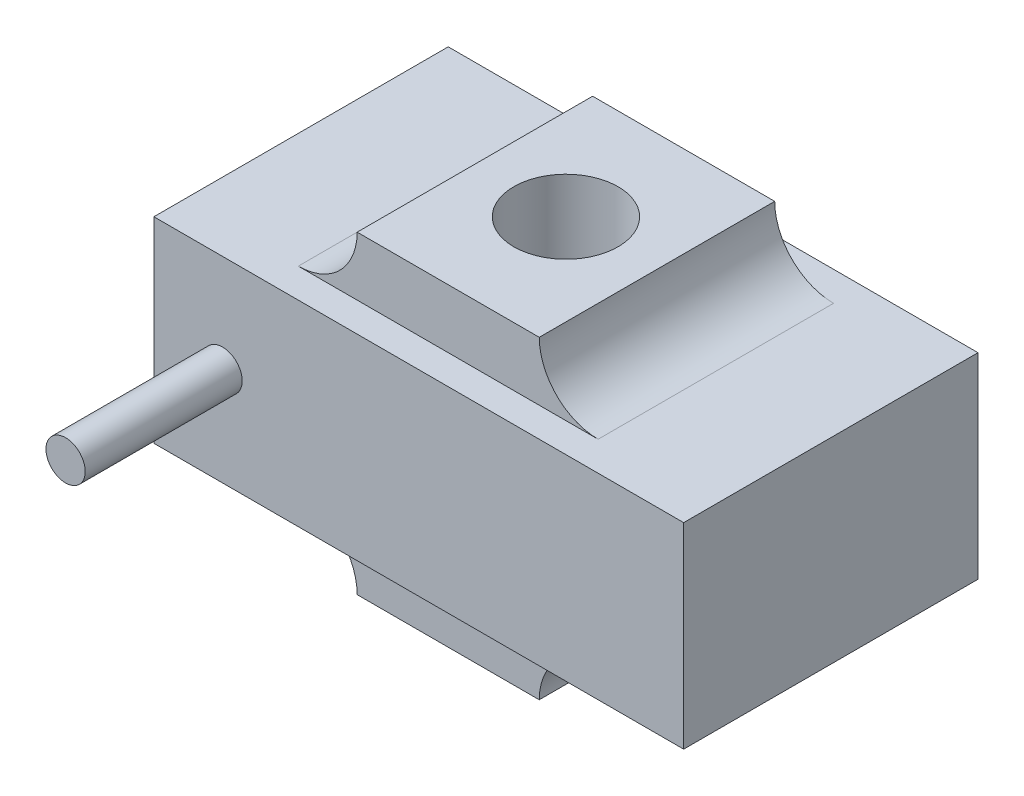
ISO-10303-21;
HEADER;
FILE_DESCRIPTION(('STEP AP214'),'2;1');
FILE_NAME('part.step','',(''),(''),'','','');
FILE_SCHEMA(('AUTOMOTIVE_DESIGN { 1 0 10303 214 1 1 1 1 }'));
ENDSEC;
DATA;
#1=APPLICATION_CONTEXT('core data for automotive mechanical design processes');
#2=APPLICATION_PROTOCOL_DEFINITION('international standard','automotive_design',2000,#1);
#3=PRODUCT_CONTEXT('',#1,'mechanical');
#4=PRODUCT('Part','Part','',(#3));
#5=PRODUCT_RELATED_PRODUCT_CATEGORY('part','',(#4));
#6=PRODUCT_DEFINITION_FORMATION('','',#4);
#7=PRODUCT_DEFINITION_CONTEXT('part definition',#1,'design');
#8=PRODUCT_DEFINITION('design','',#6,#7);
#9=PRODUCT_DEFINITION_SHAPE('','',#8);
#10=(LENGTH_UNIT() NAMED_UNIT(*) SI_UNIT(.MILLI.,.METRE.));
#11=(NAMED_UNIT(*) PLANE_ANGLE_UNIT() SI_UNIT($,.RADIAN.));
#12=(NAMED_UNIT(*) SI_UNIT($,.STERADIAN.) SOLID_ANGLE_UNIT());
#13=UNCERTAINTY_MEASURE_WITH_UNIT(LENGTH_MEASURE(1.E-05),#10,'distance_accuracy_value','');
#14=(GEOMETRIC_REPRESENTATION_CONTEXT(3) GLOBAL_UNCERTAINTY_ASSIGNED_CONTEXT((#13)) GLOBAL_UNIT_ASSIGNED_CONTEXT((#10,
#11,#12)) REPRESENTATION_CONTEXT('',''));
#15=CARTESIAN_POINT('',(0.,0.,0.));
#16=DIRECTION('',(0.,0.,1.));
#17=DIRECTION('',(1.,0.,0.));
#18=AXIS2_PLACEMENT_3D('',#15,#16,#17);
#19=CARTESIAN_POINT('',(-21.43125,-7.9375,11.90625));
#20=DIRECTION('',(0.,0.,1.));
#21=DIRECTION('',(1.,0.,0.));
#22=AXIS2_PLACEMENT_3D('',#19,#20,#21);
#23=PLANE('',#22);
#24=DIRECTION('',(0.,-1.,0.));
#25=VECTOR('',#24,1.);
#26=CARTESIAN_POINT('',(-21.43125,7.9375,11.90625));
#27=LINE('',#26,#25);
#28=CARTESIAN_POINT('',(-21.43125,7.9375,11.90625));
#29=VERTEX_POINT('',#28);
#30=CARTESIAN_POINT('',(-21.43125,-7.9375,11.90625));
#31=VERTEX_POINT('',#30);
#32=EDGE_CURVE('E213',#29,#31,#27,.T.);
#33=ORIENTED_EDGE('',*,*,#32,.T.);
#34=DIRECTION('',(1.,0.,0.));
#35=VECTOR('',#34,1.);
#36=CARTESIAN_POINT('',(-21.43125,-7.9375,11.90625));
#37=LINE('',#36,#35);
#38=CARTESIAN_POINT('',(21.43125,-7.9375,11.90625));
#39=VERTEX_POINT('',#38);
#40=EDGE_CURVE('E216',#31,#39,#37,.T.);
#41=ORIENTED_EDGE('',*,*,#40,.T.);
#42=DIRECTION('',(0.,1.,0.));
#43=VECTOR('',#42,1.);
#44=CARTESIAN_POINT('',(21.43125,7.9375,11.90625));
#45=LINE('',#44,#43);
#46=CARTESIAN_POINT('',(21.43125,7.9375,11.90625));
#47=VERTEX_POINT('',#46);
#48=EDGE_CURVE('E218',#39,#47,#45,.T.);
#49=ORIENTED_EDGE('',*,*,#48,.T.);
#50=DIRECTION('',(-1.,0.,0.));
#51=VECTOR('',#50,1.);
#52=CARTESIAN_POINT('',(-21.43125,7.9375,11.90625));
#53=LINE('',#52,#51);
#54=EDGE_CURVE('E220',#47,#29,#53,.T.);
#55=ORIENTED_EDGE('',*,*,#54,.T.);
#56=EDGE_LOOP('',(#33,#41,#49,#55));
#57=FACE_BOUND('',#56,.T.);
#58=CARTESIAN_POINT('',(-15.875,0.,11.90625));
#59=DIRECTION('',(0.,0.,1.));
#60=DIRECTION('',(1.,0.,0.));
#61=AXIS2_PLACEMENT_3D('',#58,#59,#60);
#62=CIRCLE('',#61,1.5875);
#63=CARTESIAN_POINT('',(-14.2875,0.,11.90625));
#64=VERTEX_POINT('',#63);
#65=EDGE_CURVE('E138',#64,#64,#62,.T.);
#66=ORIENTED_EDGE('',*,*,#65,.F.);
#67=EDGE_LOOP('',(#66));
#68=FACE_BOUND('',#67,.T.);
#69=ADVANCED_FACE('F30',(#57,#68),#23,.T.);
#70=CARTESIAN_POINT('',(-21.43125,7.9375,11.90625));
#71=DIRECTION('',(0.,-1.,0.));
#72=DIRECTION('',(0.,0.,-1.));
#73=AXIS2_PLACEMENT_3D('',#70,#71,#72);
#74=PLANE('',#73);
#75=DIRECTION('',(-1.,0.,0.));
#76=VECTOR('',#75,1.);
#77=CARTESIAN_POINT('',(-21.43125,7.9375,-11.90625));
#78=LINE('',#77,#76);
#79=CARTESIAN_POINT('',(21.43125,7.9375,-11.90625));
#80=VERTEX_POINT('',#79);
#81=CARTESIAN_POINT('',(-21.43125,7.9375,-11.90625));
#82=VERTEX_POINT('',#81);
#83=EDGE_CURVE('E211',#80,#82,#78,.T.);
#84=ORIENTED_EDGE('',*,*,#83,.T.);
#85=DIRECTION('',(0.,0.,-1.));
#86=VECTOR('',#85,1.);
#87=CARTESIAN_POINT('',(-21.43125,7.9375,11.90625));
#88=LINE('',#87,#86);
#89=EDGE_CURVE('E222',#29,#82,#88,.T.);
#90=ORIENTED_EDGE('',*,*,#89,.F.);
#91=ORIENTED_EDGE('',*,*,#54,.F.);
#92=DIRECTION('',(0.,0.,-1.));
#93=VECTOR('',#92,1.);
#94=CARTESIAN_POINT('',(21.43125,7.9375,11.90625));
#95=LINE('',#94,#93);
#96=EDGE_CURVE('E225',#47,#80,#95,.T.);
#97=ORIENTED_EDGE('',*,*,#96,.T.);
#98=EDGE_LOOP('',(#84,#90,#91,#97));
#99=FACE_BOUND('',#98,.T.);
#100=DIRECTION('',(1.,0.,0.));
#101=VECTOR('',#100,1.);
#102=CARTESIAN_POINT('',(12.1285,7.9375,9.525));
#103=LINE('',#102,#101);
#104=CARTESIAN_POINT('',(-12.1285,7.9375,9.525));
#105=VERTEX_POINT('',#104);
#106=CARTESIAN_POINT('',(12.1285,7.9375,9.525));
#107=VERTEX_POINT('',#106);
#108=EDGE_CURVE('E186',#105,#107,#103,.T.);
#109=ORIENTED_EDGE('',*,*,#108,.F.);
#110=DIRECTION('',(0.,0.,-1.));
#111=VECTOR('',#110,1.);
#112=CARTESIAN_POINT('',(-12.1285,7.9375,9.525));
#113=LINE('',#112,#111);
#114=CARTESIAN_POINT('',(-12.1285,7.9375,-9.525));
#115=VERTEX_POINT('',#114);
#116=EDGE_CURVE('E201',#105,#115,#113,.T.);
#117=ORIENTED_EDGE('',*,*,#116,.T.);
#118=DIRECTION('',(1.,0.,0.));
#119=VECTOR('',#118,1.);
#120=CARTESIAN_POINT('',(12.1285,7.9375,-9.525));
#121=LINE('',#120,#119);
#122=CARTESIAN_POINT('',(12.1285,7.9375,-9.525));
#123=VERTEX_POINT('',#122);
#124=EDGE_CURVE('E177',#115,#123,#121,.T.);
#125=ORIENTED_EDGE('',*,*,#124,.T.);
#126=DIRECTION('',(0.,0.,-1.));
#127=VECTOR('',#126,1.);
#128=CARTESIAN_POINT('',(12.1285,7.9375,9.525));
#129=LINE('',#128,#127);
#130=EDGE_CURVE('E198',#107,#123,#129,.T.);
#131=ORIENTED_EDGE('',*,*,#130,.F.);
#132=EDGE_LOOP('',(#109,#117,#125,#131));
#133=FACE_BOUND('',#132,.T.);
#134=ADVANCED_FACE('F241',(#99,#133),#74,.F.);
#135=CARTESIAN_POINT('',(-21.43125,7.9375,11.90625));
#136=DIRECTION('',(1.,0.,0.));
#137=DIRECTION('',(0.,0.,-1.));
#138=AXIS2_PLACEMENT_3D('',#135,#136,#137);
#139=PLANE('',#138);
#140=DIRECTION('',(0.,-1.,0.));
#141=VECTOR('',#140,1.);
#142=CARTESIAN_POINT('',(-21.43125,7.9375,-11.90625));
#143=LINE('',#142,#141);
#144=CARTESIAN_POINT('',(-21.43125,-7.9375,-11.90625));
#145=VERTEX_POINT('',#144);
#146=EDGE_CURVE('E204',#82,#145,#143,.T.);
#147=ORIENTED_EDGE('',*,*,#146,.T.);
#148=DIRECTION('',(0.,0.,-1.));
#149=VECTOR('',#148,1.);
#150=CARTESIAN_POINT('',(-21.43125,-7.9375,11.90625));
#151=LINE('',#150,#149);
#152=EDGE_CURVE('E11',#31,#145,#151,.T.);
#153=ORIENTED_EDGE('',*,*,#152,.F.);
#154=ORIENTED_EDGE('',*,*,#32,.F.);
#155=ORIENTED_EDGE('',*,*,#89,.T.);
#156=EDGE_LOOP('',(#147,#153,#154,#155));
#157=FACE_BOUND('',#156,.T.);
#158=ADVANCED_FACE('F32',(#157),#139,.F.);
#159=CARTESIAN_POINT('',(-21.43125,-7.9375,11.90625));
#160=DIRECTION('',(0.,1.,0.));
#161=DIRECTION('',(0.,0.,1.));
#162=AXIS2_PLACEMENT_3D('',#159,#160,#161);
#163=PLANE('',#162);
#164=DIRECTION('',(0.,0.,-1.));
#165=VECTOR('',#164,1.);
#166=CARTESIAN_POINT('',(-12.1285,-7.9375,9.525));
#167=LINE('',#166,#165);
#168=CARTESIAN_POINT('',(-12.1285,-7.9375,9.525));
#169=VERTEX_POINT('',#168);
#170=CARTESIAN_POINT('',(-12.1285,-7.9375,-9.525));
#171=VERTEX_POINT('',#170);
#172=EDGE_CURVE('E45',#169,#171,#167,.T.);
#173=ORIENTED_EDGE('',*,*,#172,.F.);
#174=DIRECTION('',(-1.,0.,0.));
#175=VECTOR('',#174,1.);
#176=CARTESIAN_POINT('',(-12.1285,-7.9375,9.525));
#177=LINE('',#176,#175);
#178=CARTESIAN_POINT('',(12.1285,-7.9375,9.525));
#179=VERTEX_POINT('',#178);
#180=EDGE_CURVE('E49',#179,#169,#177,.T.);
#181=ORIENTED_EDGE('',*,*,#180,.F.);
#182=DIRECTION('',(0.,0.,-1.));
#183=VECTOR('',#182,1.);
#184=CARTESIAN_POINT('',(12.1285,-7.9375,9.525));
#185=LINE('',#184,#183);
#186=CARTESIAN_POINT('',(12.1285,-7.9375,-9.525));
#187=VERTEX_POINT('',#186);
#188=EDGE_CURVE('E166',#179,#187,#185,.T.);
#189=ORIENTED_EDGE('',*,*,#188,.T.);
#190=DIRECTION('',(-1.,0.,0.));
#191=VECTOR('',#190,1.);
#192=CARTESIAN_POINT('',(-12.1285,-7.9375,-9.525));
#193=LINE('',#192,#191);
#194=EDGE_CURVE('E155',#187,#171,#193,.T.);
#195=ORIENTED_EDGE('',*,*,#194,.T.);
#196=EDGE_LOOP('',(#173,#181,#189,#195));
#197=FACE_BOUND('',#196,.T.);
#198=DIRECTION('',(1.,0.,0.));
#199=VECTOR('',#198,1.);
#200=CARTESIAN_POINT('',(-21.43125,-7.9375,-11.90625));
#201=LINE('',#200,#199);
#202=CARTESIAN_POINT('',(21.43125,-7.9375,-11.90625));
#203=VERTEX_POINT('',#202);
#204=EDGE_CURVE('E207',#145,#203,#201,.T.);
#205=ORIENTED_EDGE('',*,*,#204,.T.);
#206=DIRECTION('',(0.,0.,-1.));
#207=VECTOR('',#206,1.);
#208=CARTESIAN_POINT('',(21.43125,-7.9375,11.90625));
#209=LINE('',#208,#207);
#210=EDGE_CURVE('E38',#39,#203,#209,.T.);
#211=ORIENTED_EDGE('',*,*,#210,.F.);
#212=ORIENTED_EDGE('',*,*,#40,.F.);
#213=ORIENTED_EDGE('',*,*,#152,.T.);
#214=EDGE_LOOP('',(#205,#211,#212,#213));
#215=FACE_BOUND('',#214,.T.);
#216=ADVANCED_FACE('F249',(#197,#215),#163,.F.);
#217=CARTESIAN_POINT('',(21.43125,7.9375,11.90625));
#218=DIRECTION('',(-1.,0.,0.));
#219=DIRECTION('',(0.,0.,1.));
#220=AXIS2_PLACEMENT_3D('',#217,#218,#219);
#221=PLANE('',#220);
#222=DIRECTION('',(0.,1.,0.));
#223=VECTOR('',#222,1.);
#224=CARTESIAN_POINT('',(21.43125,7.9375,-11.90625));
#225=LINE('',#224,#223);
#226=EDGE_CURVE('E209',#203,#80,#225,.T.);
#227=ORIENTED_EDGE('',*,*,#226,.T.);
#228=ORIENTED_EDGE('',*,*,#96,.F.);
#229=ORIENTED_EDGE('',*,*,#48,.F.);
#230=ORIENTED_EDGE('',*,*,#210,.T.);
#231=EDGE_LOOP('',(#227,#228,#229,#230));
#232=FACE_BOUND('',#231,.T.);
#233=ADVANCED_FACE('F232',(#232),#221,.F.);
#234=CARTESIAN_POINT('',(-21.43125,-7.9375,-11.90625));
#235=DIRECTION('',(0.,0.,1.));
#236=DIRECTION('',(1.,0.,0.));
#237=AXIS2_PLACEMENT_3D('',#234,#235,#236);
#238=PLANE('',#237);
#239=ORIENTED_EDGE('',*,*,#146,.F.);
#240=ORIENTED_EDGE('',*,*,#83,.F.);
#241=ORIENTED_EDGE('',*,*,#226,.F.);
#242=ORIENTED_EDGE('',*,*,#204,.F.);
#243=EDGE_LOOP('',(#239,#240,#241,#242));
#244=FACE_BOUND('',#243,.T.);
#245=ADVANCED_FACE('F238',(#244),#238,.F.);
#246=CARTESIAN_POINT('',(-12.1285,12.7,9.525));
#247=DIRECTION('',(0.,0.,-1.));
#248=DIRECTION('',(-1.,0.,0.));
#249=AXIS2_PLACEMENT_3D('',#246,#247,#248);
#250=CYLINDRICAL_SURFACE('',#249,4.7625);
#251=CARTESIAN_POINT('',(-12.1285,12.7,-9.525));
#252=DIRECTION('',(0.,0.,-1.));
#253=DIRECTION('',(-1.,0.,0.));
#254=AXIS2_PLACEMENT_3D('',#251,#252,#253);
#255=CIRCLE('',#254,4.7625);
#256=CARTESIAN_POINT('',(-7.366,12.7,-9.525));
#257=VERTEX_POINT('',#256);
#258=EDGE_CURVE('E174',#257,#115,#255,.T.);
#259=ORIENTED_EDGE('',*,*,#258,.T.);
#260=ORIENTED_EDGE('',*,*,#116,.F.);
#261=CARTESIAN_POINT('',(-12.1285,12.7,9.525));
#262=DIRECTION('',(0.,0.,-1.));
#263=DIRECTION('',(-1.,0.,0.));
#264=AXIS2_PLACEMENT_3D('',#261,#262,#263);
#265=CIRCLE('',#264,4.7625);
#266=CARTESIAN_POINT('',(-7.366,12.7,9.525));
#267=VERTEX_POINT('',#266);
#268=EDGE_CURVE('E184',#267,#105,#265,.T.);
#269=ORIENTED_EDGE('',*,*,#268,.F.);
#270=DIRECTION('',(0.,0.,-1.));
#271=VECTOR('',#270,1.);
#272=CARTESIAN_POINT('',(-7.366,12.7,9.525));
#273=LINE('',#272,#271);
#274=EDGE_CURVE('E192',#267,#257,#273,.T.);
#275=ORIENTED_EDGE('',*,*,#274,.T.);
#276=EDGE_LOOP('',(#259,#260,#269,#275));
#277=FACE_BOUND('',#276,.T.);
#278=ADVANCED_FACE('F265',(#277),#250,.F.);
#279=CARTESIAN_POINT('',(12.1285,12.7,9.525));
#280=DIRECTION('',(0.,0.,-1.));
#281=DIRECTION('',(-1.,0.,0.));
#282=AXIS2_PLACEMENT_3D('',#279,#280,#281);
#283=CYLINDRICAL_SURFACE('',#282,4.7625);
#284=CARTESIAN_POINT('',(12.1285,12.7,-9.525));
#285=DIRECTION('',(0.,0.,-1.));
#286=DIRECTION('',(1.,0.,0.));
#287=AXIS2_PLACEMENT_3D('',#284,#285,#286);
#288=CIRCLE('',#287,4.7625);
#289=CARTESIAN_POINT('',(7.366,12.7,-9.525));
#290=VERTEX_POINT('',#289);
#291=EDGE_CURVE('E180',#123,#290,#288,.T.);
#292=ORIENTED_EDGE('',*,*,#291,.T.);
#293=DIRECTION('',(0.,0.,-1.));
#294=VECTOR('',#293,1.);
#295=CARTESIAN_POINT('',(7.366,12.7,9.525));
#296=LINE('',#295,#294);
#297=CARTESIAN_POINT('',(7.366,12.7,9.525));
#298=VERTEX_POINT('',#297);
#299=EDGE_CURVE('E195',#298,#290,#296,.T.);
#300=ORIENTED_EDGE('',*,*,#299,.F.);
#301=CARTESIAN_POINT('',(12.1285,12.7,9.525));
#302=DIRECTION('',(0.,0.,-1.));
#303=DIRECTION('',(1.,0.,0.));
#304=AXIS2_PLACEMENT_3D('',#301,#302,#303);
#305=CIRCLE('',#304,4.7625);
#306=EDGE_CURVE('E188',#107,#298,#305,.T.);
#307=ORIENTED_EDGE('',*,*,#306,.F.);
#308=ORIENTED_EDGE('',*,*,#130,.T.);
#309=EDGE_LOOP('',(#292,#300,#307,#308));
#310=FACE_BOUND('',#309,.T.);
#311=ADVANCED_FACE('F268',(#310),#283,.F.);
#312=CARTESIAN_POINT('',(-7.366,12.7,9.525));
#313=DIRECTION('',(0.,-1.,0.));
#314=DIRECTION('',(0.,0.,-1.));
#315=AXIS2_PLACEMENT_3D('',#312,#313,#314);
#316=PLANE('',#315);
#317=CARTESIAN_POINT('',(0.,12.7,0.));
#318=DIRECTION('',(0.,1.,0.));
#319=DIRECTION('',(0.,0.,1.));
#320=AXIS2_PLACEMENT_3D('',#317,#318,#319);
#321=CIRCLE('',#320,4.2164);
#322=CARTESIAN_POINT('',(0.,12.7,4.2164));
#323=VERTEX_POINT('',#322);
#324=EDGE_CURVE('E144',#323,#323,#321,.T.);
#325=ORIENTED_EDGE('',*,*,#324,.F.);
#326=EDGE_LOOP('',(#325));
#327=FACE_BOUND('',#326,.T.);
#328=DIRECTION('',(-1.,0.,0.));
#329=VECTOR('',#328,1.);
#330=CARTESIAN_POINT('',(-7.366,12.7,-9.525));
#331=LINE('',#330,#329);
#332=EDGE_CURVE('E182',#290,#257,#331,.T.);
#333=ORIENTED_EDGE('',*,*,#332,.T.);
#334=ORIENTED_EDGE('',*,*,#274,.F.);
#335=DIRECTION('',(-1.,0.,0.));
#336=VECTOR('',#335,1.);
#337=CARTESIAN_POINT('',(-7.366,12.7,9.525));
#338=LINE('',#337,#336);
#339=EDGE_CURVE('E190',#298,#267,#338,.T.);
#340=ORIENTED_EDGE('',*,*,#339,.F.);
#341=ORIENTED_EDGE('',*,*,#299,.T.);
#342=EDGE_LOOP('',(#333,#334,#340,#341));
#343=FACE_BOUND('',#342,.T.);
#344=ADVANCED_FACE('F272',(#327,#343),#316,.F.);
#345=CARTESIAN_POINT('',(-12.1285,12.7,9.525));
#346=DIRECTION('',(0.,0.,-1.));
#347=DIRECTION('',(-1.,0.,0.));
#348=AXIS2_PLACEMENT_3D('',#345,#346,#347);
#349=PLANE('',#348);
#350=ORIENTED_EDGE('',*,*,#268,.T.);
#351=ORIENTED_EDGE('',*,*,#108,.T.);
#352=ORIENTED_EDGE('',*,*,#306,.T.);
#353=ORIENTED_EDGE('',*,*,#339,.T.);
#354=EDGE_LOOP('',(#350,#351,#352,#353));
#355=FACE_BOUND('',#354,.T.);
#356=ADVANCED_FACE('F276',(#355),#349,.F.);
#357=CARTESIAN_POINT('',(-12.1285,12.7,-9.525));
#358=DIRECTION('',(0.,0.,-1.));
#359=DIRECTION('',(-1.,0.,0.));
#360=AXIS2_PLACEMENT_3D('',#357,#358,#359);
#361=PLANE('',#360);
#362=ORIENTED_EDGE('',*,*,#258,.F.);
#363=ORIENTED_EDGE('',*,*,#332,.F.);
#364=ORIENTED_EDGE('',*,*,#291,.F.);
#365=ORIENTED_EDGE('',*,*,#124,.F.);
#366=EDGE_LOOP('',(#362,#363,#364,#365));
#367=FACE_BOUND('',#366,.T.);
#368=ADVANCED_FACE('F280',(#367),#361,.T.);
#369=CARTESIAN_POINT('',(-12.1285,-12.7,9.525));
#370=DIRECTION('',(0.,0.,-1.));
#371=DIRECTION('',(-1.,0.,0.));
#372=AXIS2_PLACEMENT_3D('',#369,#370,#371);
#373=CYLINDRICAL_SURFACE('',#372,4.7625);
#374=CARTESIAN_POINT('',(-12.1285,-12.7,-9.525));
#375=DIRECTION('',(0.,0.,-1.));
#376=DIRECTION('',(1.,0.,0.));
#377=AXIS2_PLACEMENT_3D('',#374,#375,#376);
#378=CIRCLE('',#377,4.7625);
#379=CARTESIAN_POINT('',(-7.366,-12.7,-9.525));
#380=VERTEX_POINT('',#379);
#381=EDGE_CURVE('E147',#171,#380,#378,.T.);
#382=ORIENTED_EDGE('',*,*,#381,.T.);
#383=DIRECTION('',(0.,0.,-1.));
#384=VECTOR('',#383,1.);
#385=CARTESIAN_POINT('',(-7.366,-12.7,9.525));
#386=LINE('',#385,#384);
#387=CARTESIAN_POINT('',(-7.366,-12.7,9.525));
#388=VERTEX_POINT('',#387);
#389=EDGE_CURVE('E171',#388,#380,#386,.T.);
#390=ORIENTED_EDGE('',*,*,#389,.F.);
#391=CARTESIAN_POINT('',(-12.1285,-12.7,9.525));
#392=DIRECTION('',(0.,0.,-1.));
#393=DIRECTION('',(1.,0.,0.));
#394=AXIS2_PLACEMENT_3D('',#391,#392,#393);
#395=CIRCLE('',#394,4.7625);
#396=EDGE_CURVE('E157',#169,#388,#395,.T.);
#397=ORIENTED_EDGE('',*,*,#396,.F.);
#398=ORIENTED_EDGE('',*,*,#172,.T.);
#399=EDGE_LOOP('',(#382,#390,#397,#398));
#400=FACE_BOUND('',#399,.T.);
#401=ADVANCED_FACE('F284',(#400),#373,.F.);
#402=CARTESIAN_POINT('',(-7.366,-12.7,9.525));
#403=DIRECTION('',(0.,1.,0.));
#404=DIRECTION('',(0.,0.,1.));
#405=AXIS2_PLACEMENT_3D('',#402,#403,#404);
#406=PLANE('',#405);
#407=CARTESIAN_POINT('',(0.,-12.7,0.));
#408=DIRECTION('',(0.,-1.,0.));
#409=DIRECTION('',(0.,0.,-1.));
#410=AXIS2_PLACEMENT_3D('',#407,#408,#409);
#411=CIRCLE('',#410,4.21639999999999);
#412=CARTESIAN_POINT('',(0.,-12.7,-4.21639999999999));
#413=VERTEX_POINT('',#412);
#414=EDGE_CURVE('E131',#413,#413,#411,.T.);
#415=ORIENTED_EDGE('',*,*,#414,.F.);
#416=EDGE_LOOP('',(#415));
#417=FACE_BOUND('',#416,.T.);
#418=DIRECTION('',(1.,0.,0.));
#419=VECTOR('',#418,1.);
#420=CARTESIAN_POINT('',(-7.366,-12.7,-9.525));
#421=LINE('',#420,#419);
#422=CARTESIAN_POINT('',(7.366,-12.7,-9.525));
#423=VERTEX_POINT('',#422);
#424=EDGE_CURVE('E150',#380,#423,#421,.T.);
#425=ORIENTED_EDGE('',*,*,#424,.T.);
#426=DIRECTION('',(0.,0.,-1.));
#427=VECTOR('',#426,1.);
#428=CARTESIAN_POINT('',(7.366,-12.7,9.525));
#429=LINE('',#428,#427);
#430=CARTESIAN_POINT('',(7.366,-12.7,9.525));
#431=VERTEX_POINT('',#430);
#432=EDGE_CURVE('E168',#431,#423,#429,.T.);
#433=ORIENTED_EDGE('',*,*,#432,.F.);
#434=DIRECTION('',(1.,0.,0.));
#435=VECTOR('',#434,1.);
#436=CARTESIAN_POINT('',(-7.366,-12.7,9.525));
#437=LINE('',#436,#435);
#438=EDGE_CURVE('E160',#388,#431,#437,.T.);
#439=ORIENTED_EDGE('',*,*,#438,.F.);
#440=ORIENTED_EDGE('',*,*,#389,.T.);
#441=EDGE_LOOP('',(#425,#433,#439,#440));
#442=FACE_BOUND('',#441,.T.);
#443=ADVANCED_FACE('F288',(#417,#442),#406,.F.);
#444=CARTESIAN_POINT('',(12.1285,-12.7,9.525));
#445=DIRECTION('',(0.,0.,-1.));
#446=DIRECTION('',(-1.,0.,0.));
#447=AXIS2_PLACEMENT_3D('',#444,#445,#446);
#448=CYLINDRICAL_SURFACE('',#447,4.7625);
#449=CARTESIAN_POINT('',(12.1285,-12.7,-9.525));
#450=DIRECTION('',(0.,0.,-1.));
#451=DIRECTION('',(-1.,0.,0.));
#452=AXIS2_PLACEMENT_3D('',#449,#450,#451);
#453=CIRCLE('',#452,4.7625);
#454=EDGE_CURVE('E152',#423,#187,#453,.T.);
#455=ORIENTED_EDGE('',*,*,#454,.T.);
#456=ORIENTED_EDGE('',*,*,#188,.F.);
#457=CARTESIAN_POINT('',(12.1285,-12.7,9.525));
#458=DIRECTION('',(0.,0.,-1.));
#459=DIRECTION('',(-1.,0.,0.));
#460=AXIS2_PLACEMENT_3D('',#457,#458,#459);
#461=CIRCLE('',#460,4.7625);
#462=EDGE_CURVE('E162',#431,#179,#461,.T.);
#463=ORIENTED_EDGE('',*,*,#462,.F.);
#464=ORIENTED_EDGE('',*,*,#432,.T.);
#465=EDGE_LOOP('',(#455,#456,#463,#464));
#466=FACE_BOUND('',#465,.T.);
#467=ADVANCED_FACE('F292',(#466),#448,.F.);
#468=CARTESIAN_POINT('',(-12.1285,-12.7,9.525));
#469=DIRECTION('',(0.,0.,1.));
#470=DIRECTION('',(1.,0.,0.));
#471=AXIS2_PLACEMENT_3D('',#468,#469,#470);
#472=PLANE('',#471);
#473=ORIENTED_EDGE('',*,*,#396,.T.);
#474=ORIENTED_EDGE('',*,*,#438,.T.);
#475=ORIENTED_EDGE('',*,*,#462,.T.);
#476=ORIENTED_EDGE('',*,*,#180,.T.);
#477=EDGE_LOOP('',(#473,#474,#475,#476));
#478=FACE_BOUND('',#477,.T.);
#479=ADVANCED_FACE('F296',(#478),#472,.T.);
#480=CARTESIAN_POINT('',(-12.1285,-12.7,-9.525));
#481=DIRECTION('',(0.,0.,1.));
#482=DIRECTION('',(1.,0.,0.));
#483=AXIS2_PLACEMENT_3D('',#480,#481,#482);
#484=PLANE('',#483);
#485=ORIENTED_EDGE('',*,*,#381,.F.);
#486=ORIENTED_EDGE('',*,*,#194,.F.);
#487=ORIENTED_EDGE('',*,*,#454,.F.);
#488=ORIENTED_EDGE('',*,*,#424,.F.);
#489=EDGE_LOOP('',(#485,#486,#487,#488));
#490=FACE_BOUND('',#489,.T.);
#491=ADVANCED_FACE('F300',(#490),#484,.F.);
#492=CARTESIAN_POINT('',(0.,12.7,0.));
#493=DIRECTION('',(0.,1.,0.));
#494=DIRECTION('',(0.,0.,1.));
#495=AXIS2_PLACEMENT_3D('',#492,#493,#494);
#496=CYLINDRICAL_SURFACE('',#495,4.2164);
#497=CARTESIAN_POINT('',(0.,3.175,0.));
#498=DIRECTION('',(0.,1.,0.));
#499=DIRECTION('',(0.,0.,1.));
#500=AXIS2_PLACEMENT_3D('',#497,#498,#499);
#501=CIRCLE('',#500,4.2164);
#502=CARTESIAN_POINT('',(0.,3.175,4.2164));
#503=VERTEX_POINT('',#502);
#504=EDGE_CURVE('E135',#503,#503,#501,.T.);
#505=ORIENTED_EDGE('',*,*,#504,.F.);
#506=EDGE_LOOP('',(#505));
#507=FACE_BOUND('',#506,.T.);
#508=ORIENTED_EDGE('',*,*,#324,.T.);
#509=EDGE_LOOP('',(#508));
#510=FACE_BOUND('',#509,.T.);
#511=ADVANCED_FACE('F304',(#507,#510),#496,.F.);
#512=CARTESIAN_POINT('',(0.,3.175,0.));
#513=DIRECTION('',(0.,1.,0.));
#514=DIRECTION('',(0.,0.,1.));
#515=AXIS2_PLACEMENT_3D('',#512,#513,#514);
#516=CONICAL_SURFACE('',#515,4.2164,1.02974425867665);
#517=CARTESIAN_POINT('',(0.,0.641531285932195,0.));
#518=VERTEX_POINT('',#517);
#519=VERTEX_LOOP('',#518);
#520=FACE_BOUND('',#519,.T.);
#521=ORIENTED_EDGE('',*,*,#504,.T.);
#522=EDGE_LOOP('',(#521));
#523=FACE_BOUND('',#522,.T.);
#524=ADVANCED_FACE('F308',(#520,#523),#516,.F.);
#525=CARTESIAN_POINT('',(0.,-12.7,0.));
#526=DIRECTION('',(0.,-1.,0.));
#527=DIRECTION('',(0.,0.,-1.));
#528=AXIS2_PLACEMENT_3D('',#525,#526,#527);
#529=CYLINDRICAL_SURFACE('',#528,4.21639999999999);
#530=CARTESIAN_POINT('',(0.,-3.175,0.));
#531=DIRECTION('',(0.,-1.,0.));
#532=DIRECTION('',(0.,0.,-1.));
#533=AXIS2_PLACEMENT_3D('',#530,#531,#532);
#534=CIRCLE('',#533,4.2164);
#535=CARTESIAN_POINT('',(0.,-3.175,-4.2164));
#536=VERTEX_POINT('',#535);
#537=EDGE_CURVE('E129',#536,#536,#534,.T.);
#538=ORIENTED_EDGE('',*,*,#537,.F.);
#539=EDGE_LOOP('',(#538));
#540=FACE_BOUND('',#539,.T.);
#541=ORIENTED_EDGE('',*,*,#414,.T.);
#542=EDGE_LOOP('',(#541));
#543=FACE_BOUND('',#542,.T.);
#544=ADVANCED_FACE('F125',(#540,#543),#529,.F.);
#545=CARTESIAN_POINT('',(0.,-3.175,0.));
#546=DIRECTION('',(0.,-1.,0.));
#547=DIRECTION('',(0.,0.,-1.));
#548=AXIS2_PLACEMENT_3D('',#545,#546,#547);
#549=CONICAL_SURFACE('',#548,4.2164,1.02974425867665);
#550=CARTESIAN_POINT('',(0.,-0.641531285932194,0.));
#551=VERTEX_POINT('',#550);
#552=VERTEX_LOOP('',#551);
#553=FACE_BOUND('',#552,.T.);
#554=ORIENTED_EDGE('',*,*,#537,.T.);
#555=EDGE_LOOP('',(#554));
#556=FACE_BOUND('',#555,.T.);
#557=ADVANCED_FACE('F121',(#553,#556),#549,.F.);
#558=CARTESIAN_POINT('',(-15.875,0.,24.60625));
#559=DIRECTION('',(0.,0.,-1.));
#560=DIRECTION('',(-1.,0.,0.));
#561=AXIS2_PLACEMENT_3D('',#558,#559,#560);
#562=CYLINDRICAL_SURFACE('',#561,1.5875);
#563=CARTESIAN_POINT('',(-15.875,0.,24.60625));
#564=DIRECTION('',(0.,0.,1.));
#565=DIRECTION('',(1.,0.,0.));
#566=AXIS2_PLACEMENT_3D('',#563,#564,#565);
#567=CIRCLE('',#566,1.5875);
#568=CARTESIAN_POINT('',(-14.2875,0.,24.60625));
#569=VERTEX_POINT('',#568);
#570=EDGE_CURVE('E132',#569,#569,#567,.T.);
#571=ORIENTED_EDGE('',*,*,#570,.F.);
#572=EDGE_LOOP('',(#571));
#573=FACE_BOUND('',#572,.T.);
#574=ORIENTED_EDGE('',*,*,#65,.T.);
#575=EDGE_LOOP('',(#574));
#576=FACE_BOUND('',#575,.T.);
#577=ADVANCED_FACE('F124',(#573,#576),#562,.T.);
#578=CARTESIAN_POINT('',(-15.875,0.,24.60625));
#579=DIRECTION('',(0.,0.,1.));
#580=DIRECTION('',(1.,0.,0.));
#581=AXIS2_PLACEMENT_3D('',#578,#579,#580);
#582=PLANE('',#581);
#583=ORIENTED_EDGE('',*,*,#570,.T.);
#584=EDGE_LOOP('',(#583));
#585=FACE_BOUND('',#584,.T.);
#586=ADVANCED_FACE('F317',(#585),#582,.T.);
#587=CLOSED_SHELL('',(#69,#134,#158,#216,#233,#245,#278,#311,#344,#356,#368,#401,#443,#467,#479,
#491,#511,#524,#544,#557,#577,#586));
#588=MANIFOLD_SOLID_BREP('B2',#587);
#589=ADVANCED_BREP_SHAPE_REPRESENTATION('',(#18,#588),#14);
#590=SHAPE_DEFINITION_REPRESENTATION(#9,#589);
ENDSEC;
END-ISO-10303-21;
